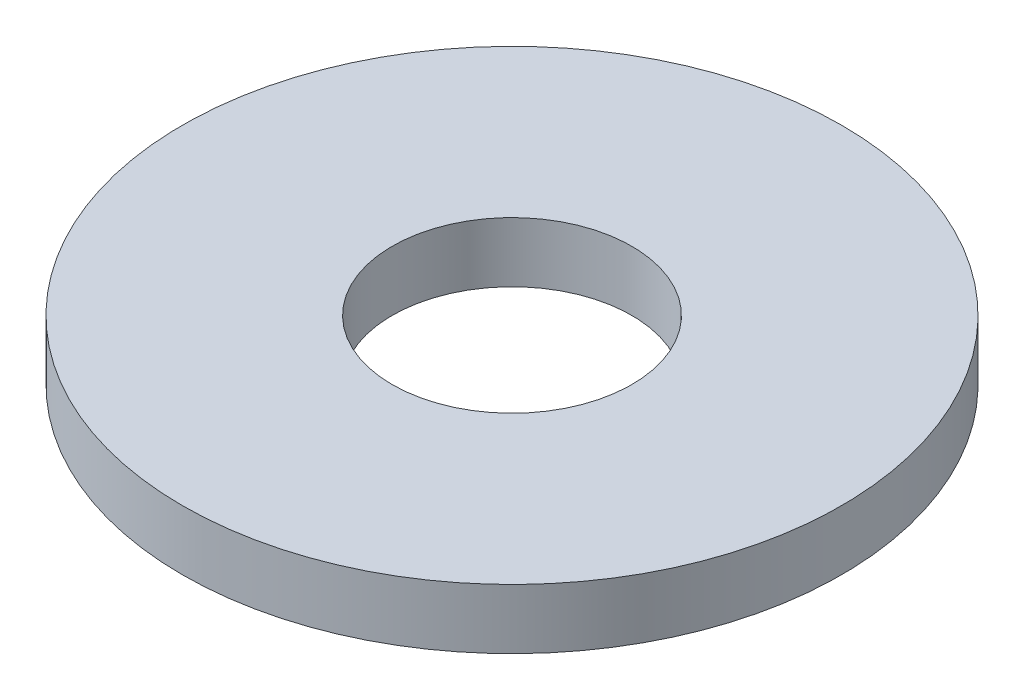
ISO-10303-21;
HEADER;
FILE_DESCRIPTION(('STEP AP214'),'2;1');
FILE_NAME('part.step','',(''),(''),'','','');
FILE_SCHEMA(('AUTOMOTIVE_DESIGN { 1 0 10303 214 1 1 1 1 }'));
ENDSEC;
DATA;
#1=APPLICATION_CONTEXT('core data for automotive mechanical design processes');
#2=APPLICATION_PROTOCOL_DEFINITION('international standard','automotive_design',2000,#1);
#3=PRODUCT_CONTEXT('',#1,'mechanical');
#4=PRODUCT('Part','Part','',(#3));
#5=PRODUCT_RELATED_PRODUCT_CATEGORY('part','',(#4));
#6=PRODUCT_DEFINITION_FORMATION('','',#4);
#7=PRODUCT_DEFINITION_CONTEXT('part definition',#1,'design');
#8=PRODUCT_DEFINITION('design','',#6,#7);
#9=PRODUCT_DEFINITION_SHAPE('','',#8);
#10=(LENGTH_UNIT() NAMED_UNIT(*) SI_UNIT(.MILLI.,.METRE.));
#11=(NAMED_UNIT(*) PLANE_ANGLE_UNIT() SI_UNIT($,.RADIAN.));
#12=(NAMED_UNIT(*) SI_UNIT($,.STERADIAN.) SOLID_ANGLE_UNIT());
#13=UNCERTAINTY_MEASURE_WITH_UNIT(LENGTH_MEASURE(1.E-05),#10,'distance_accuracy_value','');
#14=(GEOMETRIC_REPRESENTATION_CONTEXT(3) GLOBAL_UNCERTAINTY_ASSIGNED_CONTEXT((#13)) GLOBAL_UNIT_ASSIGNED_CONTEXT((#10,
#11,#12)) REPRESENTATION_CONTEXT('',''));
#15=CARTESIAN_POINT('',(0.,0.,0.));
#16=DIRECTION('',(0.,0.,1.));
#17=DIRECTION('',(1.,0.,0.));
#18=AXIS2_PLACEMENT_3D('',#15,#16,#17);
#19=CARTESIAN_POINT('',(0.,3.175,0.));
#20=DIRECTION('',(0.,1.,0.));
#21=DIRECTION('',(0.,0.,1.));
#22=AXIS2_PLACEMENT_3D('',#19,#20,#21);
#23=PLANE('',#22);
#24=CARTESIAN_POINT('',(0.,3.175,0.));
#25=DIRECTION('',(0.,1.,0.));
#26=DIRECTION('',(0.,0.,1.));
#27=AXIS2_PLACEMENT_3D('',#24,#25,#26);
#28=CIRCLE('',#27,17.4625);
#29=CARTESIAN_POINT('',(0.,3.175,17.4625));
#30=VERTEX_POINT('',#29);
#31=EDGE_CURVE('E10',#30,#30,#28,.T.);
#32=ORIENTED_EDGE('',*,*,#31,.T.);
#33=EDGE_LOOP('',(#32));
#34=FACE_BOUND('',#33,.T.);
#35=CARTESIAN_POINT('',(0.,3.175,0.));
#36=DIRECTION('',(0.,1.,0.));
#37=DIRECTION('',(0.,0.,1.));
#38=AXIS2_PLACEMENT_3D('',#35,#36,#37);
#39=CIRCLE('',#38,6.35);
#40=CARTESIAN_POINT('',(0.,3.175,6.35));
#41=VERTEX_POINT('',#40);
#42=EDGE_CURVE('E41',#41,#41,#39,.T.);
#43=ORIENTED_EDGE('',*,*,#42,.F.);
#44=EDGE_LOOP('',(#43));
#45=FACE_BOUND('',#44,.T.);
#46=ADVANCED_FACE('F30',(#34,#45),#23,.T.);
#47=CARTESIAN_POINT('',(0.,0.,0.));
#48=DIRECTION('',(0.,1.,0.));
#49=DIRECTION('',(0.,0.,1.));
#50=AXIS2_PLACEMENT_3D('',#47,#48,#49);
#51=PLANE('',#50);
#52=CARTESIAN_POINT('',(0.,0.,0.));
#53=DIRECTION('',(0.,1.,0.));
#54=DIRECTION('',(0.,0.,1.));
#55=AXIS2_PLACEMENT_3D('',#52,#53,#54);
#56=CIRCLE('',#55,17.4625);
#57=CARTESIAN_POINT('',(0.,0.,17.4625));
#58=VERTEX_POINT('',#57);
#59=EDGE_CURVE('E34',#58,#58,#56,.T.);
#60=ORIENTED_EDGE('',*,*,#59,.F.);
#61=EDGE_LOOP('',(#60));
#62=FACE_BOUND('',#61,.T.);
#63=CARTESIAN_POINT('',(0.,0.,0.));
#64=DIRECTION('',(0.,1.,0.));
#65=DIRECTION('',(0.,0.,1.));
#66=AXIS2_PLACEMENT_3D('',#63,#64,#65);
#67=CIRCLE('',#66,6.35);
#68=CARTESIAN_POINT('',(0.,0.,6.35));
#69=VERTEX_POINT('',#68);
#70=EDGE_CURVE('E43',#69,#69,#67,.T.);
#71=ORIENTED_EDGE('',*,*,#70,.T.);
#72=EDGE_LOOP('',(#71));
#73=FACE_BOUND('',#72,.T.);
#74=ADVANCED_FACE('F53',(#62,#73),#51,.F.);
#75=CARTESIAN_POINT('',(0.,3.175,0.));
#76=DIRECTION('',(0.,-1.,0.));
#77=DIRECTION('',(0.,0.,-1.));
#78=AXIS2_PLACEMENT_3D('',#75,#76,#77);
#79=CYLINDRICAL_SURFACE('',#78,17.4625);
#80=ORIENTED_EDGE('',*,*,#31,.F.);
#81=EDGE_LOOP('',(#80));
#82=FACE_BOUND('',#81,.T.);
#83=ORIENTED_EDGE('',*,*,#59,.T.);
#84=EDGE_LOOP('',(#83));
#85=FACE_BOUND('',#84,.T.);
#86=ADVANCED_FACE('F32',(#82,#85),#79,.T.);
#87=CARTESIAN_POINT('',(0.,3.175,0.));
#88=DIRECTION('',(0.,-1.,0.));
#89=DIRECTION('',(0.,0.,-1.));
#90=AXIS2_PLACEMENT_3D('',#87,#88,#89);
#91=CYLINDRICAL_SURFACE('',#90,6.35);
#92=ORIENTED_EDGE('',*,*,#42,.T.);
#93=EDGE_LOOP('',(#92));
#94=FACE_BOUND('',#93,.T.);
#95=ORIENTED_EDGE('',*,*,#70,.F.);
#96=EDGE_LOOP('',(#95));
#97=FACE_BOUND('',#96,.T.);
#98=ADVANCED_FACE('F49',(#94,#97),#91,.F.);
#99=CLOSED_SHELL('',(#46,#74,#86,#98));
#100=MANIFOLD_SOLID_BREP('B2',#99);
#101=ADVANCED_BREP_SHAPE_REPRESENTATION('',(#18,#100),#14);
#102=SHAPE_DEFINITION_REPRESENTATION(#9,#101);
ENDSEC;
END-ISO-10303-21;
